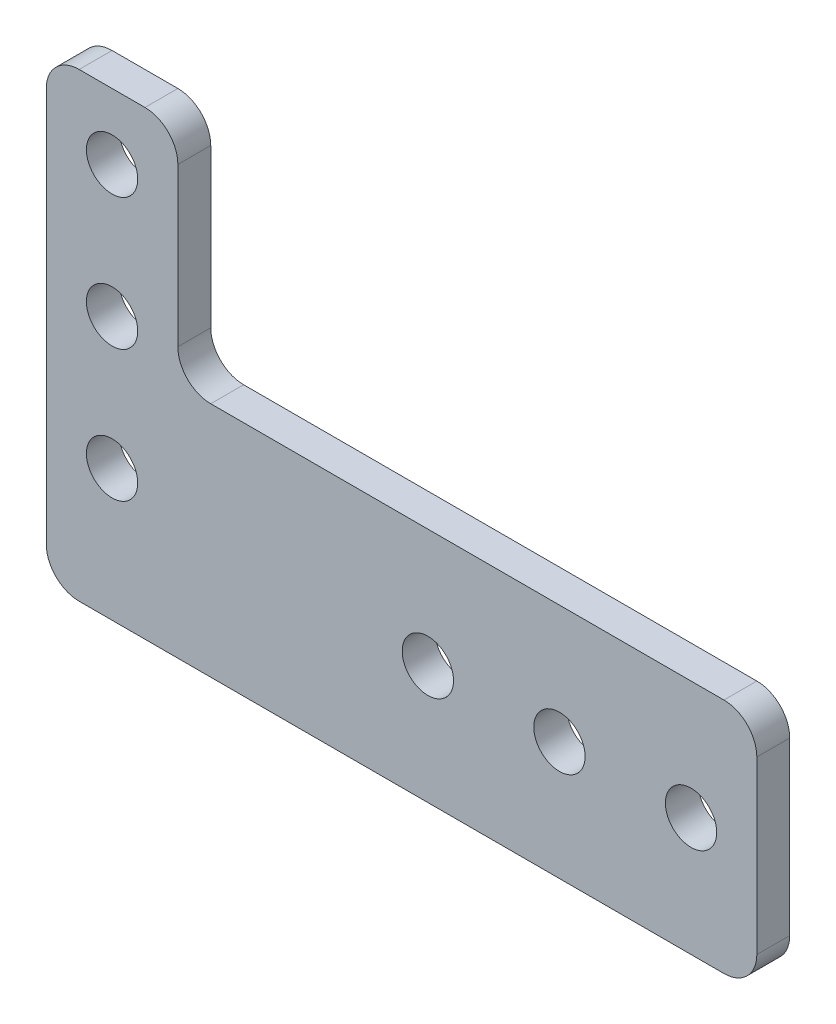
ISO-10303-21;
HEADER;
FILE_DESCRIPTION(('STEP AP214'),'2;1');
FILE_NAME('part.step','',(''),(''),'','','');
FILE_SCHEMA(('AUTOMOTIVE_DESIGN { 1 0 10303 214 1 1 1 1 }'));
ENDSEC;
DATA;
#1=APPLICATION_CONTEXT('core data for automotive mechanical design processes');
#2=APPLICATION_PROTOCOL_DEFINITION('international standard','automotive_design',2000,#1);
#3=PRODUCT_CONTEXT('',#1,'mechanical');
#4=PRODUCT('Part','Part','',(#3));
#5=PRODUCT_RELATED_PRODUCT_CATEGORY('part','',(#4));
#6=PRODUCT_DEFINITION_FORMATION('','',#4);
#7=PRODUCT_DEFINITION_CONTEXT('part definition',#1,'design');
#8=PRODUCT_DEFINITION('design','',#6,#7);
#9=PRODUCT_DEFINITION_SHAPE('','',#8);
#10=(LENGTH_UNIT() NAMED_UNIT(*) SI_UNIT(.MILLI.,.METRE.));
#11=(NAMED_UNIT(*) PLANE_ANGLE_UNIT() SI_UNIT($,.RADIAN.));
#12=(NAMED_UNIT(*) SI_UNIT($,.STERADIAN.) SOLID_ANGLE_UNIT());
#13=UNCERTAINTY_MEASURE_WITH_UNIT(LENGTH_MEASURE(1.E-05),#10,'distance_accuracy_value','');
#14=(GEOMETRIC_REPRESENTATION_CONTEXT(3) GLOBAL_UNCERTAINTY_ASSIGNED_CONTEXT((#13)) GLOBAL_UNIT_ASSIGNED_CONTEXT((#10,
#11,#12)) REPRESENTATION_CONTEXT('',''));
#15=CARTESIAN_POINT('',(0.,0.,0.));
#16=DIRECTION('',(0.,0.,1.));
#17=DIRECTION('',(1.,0.,0.));
#18=AXIS2_PLACEMENT_3D('',#15,#16,#17);
#19=CARTESIAN_POINT('',(0.,0.,3.175));
#20=DIRECTION('',(0.,0.,-1.));
#21=DIRECTION('',(-1.,0.,0.));
#22=AXIS2_PLACEMENT_3D('',#19,#20,#21);
#23=PLANE('',#22);
#24=DIRECTION('',(0.,1.,0.));
#25=VECTOR('',#24,1.);
#26=CARTESIAN_POINT('',(69.85,1.27,3.175));
#27=LINE('',#26,#25);
#28=CARTESIAN_POINT('',(69.85,4.445,3.175));
#29=VERTEX_POINT('',#28);
#30=CARTESIAN_POINT('',(69.85,20.955,3.175));
#31=VERTEX_POINT('',#30);
#32=EDGE_CURVE('E237',#29,#31,#27,.T.);
#33=ORIENTED_EDGE('',*,*,#32,.T.);
#34=CARTESIAN_POINT('',(66.675,20.955,3.175));
#35=DIRECTION('',(0.,0.,-1.));
#36=DIRECTION('',(-1.,0.,0.));
#37=AXIS2_PLACEMENT_3D('',#34,#35,#36);
#38=CIRCLE('',#37,3.175);
#39=CARTESIAN_POINT('',(66.675,24.13,3.175));
#40=VERTEX_POINT('',#39);
#41=EDGE_CURVE('E203',#31,#40,#38,.F.);
#42=ORIENTED_EDGE('',*,*,#41,.T.);
#43=DIRECTION('',(-1.,0.,0.));
#44=VECTOR('',#43,1.);
#45=CARTESIAN_POINT('',(69.85,24.13,3.175));
#46=LINE('',#45,#44);
#47=CARTESIAN_POINT('',(17.145,24.13,3.175));
#48=VERTEX_POINT('',#47);
#49=EDGE_CURVE('E153',#40,#48,#46,.T.);
#50=ORIENTED_EDGE('',*,*,#49,.T.);
#51=CARTESIAN_POINT('',(17.145,27.305,3.175));
#52=DIRECTION('',(0.,0.,-1.));
#53=DIRECTION('',(-1.,0.,0.));
#54=AXIS2_PLACEMENT_3D('',#51,#52,#53);
#55=CIRCLE('',#54,3.175);
#56=CARTESIAN_POINT('',(13.97,27.305,3.175));
#57=VERTEX_POINT('',#56);
#58=EDGE_CURVE('E11',#48,#57,#55,.T.);
#59=ORIENTED_EDGE('',*,*,#58,.T.);
#60=DIRECTION('',(0.,1.,0.));
#61=VECTOR('',#60,1.);
#62=CARTESIAN_POINT('',(13.97,45.72,3.175));
#63=LINE('',#62,#61);
#64=CARTESIAN_POINT('',(13.97,42.545,3.175));
#65=VERTEX_POINT('',#64);
#66=EDGE_CURVE('E174',#57,#65,#63,.T.);
#67=ORIENTED_EDGE('',*,*,#66,.T.);
#68=CARTESIAN_POINT('',(10.795,42.545,3.175));
#69=DIRECTION('',(0.,0.,-1.));
#70=DIRECTION('',(-1.,0.,0.));
#71=AXIS2_PLACEMENT_3D('',#68,#69,#70);
#72=CIRCLE('',#71,3.175);
#73=CARTESIAN_POINT('',(10.795,45.72,3.175));
#74=VERTEX_POINT('',#73);
#75=EDGE_CURVE('E191',#65,#74,#72,.F.);
#76=ORIENTED_EDGE('',*,*,#75,.T.);
#77=DIRECTION('',(-1.,0.,0.));
#78=VECTOR('',#77,1.);
#79=CARTESIAN_POINT('',(1.27,45.72,3.175));
#80=LINE('',#79,#78);
#81=CARTESIAN_POINT('',(4.445,45.72,3.175));
#82=VERTEX_POINT('',#81);
#83=EDGE_CURVE('E167',#74,#82,#80,.T.);
#84=ORIENTED_EDGE('',*,*,#83,.T.);
#85=CARTESIAN_POINT('',(4.445,42.545,3.175));
#86=DIRECTION('',(0.,0.,-1.));
#87=DIRECTION('',(-1.,0.,0.));
#88=AXIS2_PLACEMENT_3D('',#85,#86,#87);
#89=CIRCLE('',#88,3.175);
#90=CARTESIAN_POINT('',(1.27,42.545,3.175));
#91=VERTEX_POINT('',#90);
#92=EDGE_CURVE('E194',#82,#91,#89,.F.);
#93=ORIENTED_EDGE('',*,*,#92,.T.);
#94=DIRECTION('',(0.,-1.,0.));
#95=VECTOR('',#94,1.);
#96=CARTESIAN_POINT('',(1.27,1.27,3.175));
#97=LINE('',#96,#95);
#98=CARTESIAN_POINT('',(1.27,4.445,3.175));
#99=VERTEX_POINT('',#98);
#100=EDGE_CURVE('E245',#91,#99,#97,.T.);
#101=ORIENTED_EDGE('',*,*,#100,.T.);
#102=CARTESIAN_POINT('',(4.445,4.445,3.175));
#103=DIRECTION('',(0.,0.,-1.));
#104=DIRECTION('',(-1.,0.,0.));
#105=AXIS2_PLACEMENT_3D('',#102,#103,#104);
#106=CIRCLE('',#105,3.175);
#107=CARTESIAN_POINT('',(4.445,1.27,3.175));
#108=VERTEX_POINT('',#107);
#109=EDGE_CURVE('E197',#99,#108,#106,.F.);
#110=ORIENTED_EDGE('',*,*,#109,.T.);
#111=DIRECTION('',(1.,0.,0.));
#112=VECTOR('',#111,1.);
#113=CARTESIAN_POINT('',(1.27,1.27,3.175));
#114=LINE('',#113,#112);
#115=CARTESIAN_POINT('',(66.675,1.27,3.175));
#116=VERTEX_POINT('',#115);
#117=EDGE_CURVE('E241',#108,#116,#114,.T.);
#118=ORIENTED_EDGE('',*,*,#117,.T.);
#119=CARTESIAN_POINT('',(66.675,4.445,3.175));
#120=DIRECTION('',(0.,0.,-1.));
#121=DIRECTION('',(-1.,0.,0.));
#122=AXIS2_PLACEMENT_3D('',#119,#120,#121);
#123=CIRCLE('',#122,3.175);
#124=EDGE_CURVE('E200',#116,#29,#123,.F.);
#125=ORIENTED_EDGE('',*,*,#124,.T.);
#126=EDGE_LOOP('',(#33,#42,#50,#59,#67,#76,#84,#93,#101,#110,#118,#125));
#127=FACE_BOUND('',#126,.T.);
#128=CARTESIAN_POINT('',(7.62,39.37,3.175));
#129=DIRECTION('',(0.,0.,1.));
#130=DIRECTION('',(1.,0.,0.));
#131=AXIS2_PLACEMENT_3D('',#128,#129,#130);
#132=CIRCLE('',#131,2.4765);
#133=CARTESIAN_POINT('',(10.0965,39.37,3.175));
#134=VERTEX_POINT('',#133);
#135=EDGE_CURVE('E263',#134,#134,#132,.T.);
#136=ORIENTED_EDGE('',*,*,#135,.F.);
#137=EDGE_LOOP('',(#136));
#138=FACE_BOUND('',#137,.T.);
#139=CARTESIAN_POINT('',(7.62,26.67,3.175));
#140=DIRECTION('',(0.,0.,1.));
#141=DIRECTION('',(1.,0.,0.));
#142=AXIS2_PLACEMENT_3D('',#139,#140,#141);
#143=CIRCLE('',#142,2.4765);
#144=CARTESIAN_POINT('',(10.0965,26.67,3.175));
#145=VERTEX_POINT('',#144);
#146=EDGE_CURVE('E518',#145,#145,#143,.T.);
#147=ORIENTED_EDGE('',*,*,#146,.F.);
#148=EDGE_LOOP('',(#147));
#149=FACE_BOUND('',#148,.T.);
#150=CARTESIAN_POINT('',(7.62,13.97,3.175));
#151=DIRECTION('',(0.,0.,1.));
#152=DIRECTION('',(1.,0.,0.));
#153=AXIS2_PLACEMENT_3D('',#150,#151,#152);
#154=CIRCLE('',#153,2.4765);
#155=CARTESIAN_POINT('',(10.0965,13.97,3.175));
#156=VERTEX_POINT('',#155);
#157=EDGE_CURVE('E523',#156,#156,#154,.T.);
#158=ORIENTED_EDGE('',*,*,#157,.F.);
#159=EDGE_LOOP('',(#158));
#160=FACE_BOUND('',#159,.T.);
#161=CARTESIAN_POINT('',(38.1,12.7,3.175));
#162=DIRECTION('',(0.,0.,1.));
#163=DIRECTION('',(1.,0.,0.));
#164=AXIS2_PLACEMENT_3D('',#161,#162,#163);
#165=CIRCLE('',#164,2.4765);
#166=CARTESIAN_POINT('',(40.5765,12.7,3.175));
#167=VERTEX_POINT('',#166);
#168=EDGE_CURVE('E547',#167,#167,#165,.T.);
#169=ORIENTED_EDGE('',*,*,#168,.F.);
#170=EDGE_LOOP('',(#169));
#171=FACE_BOUND('',#170,.T.);
#172=CARTESIAN_POINT('',(50.8,12.7,3.175));
#173=DIRECTION('',(0.,0.,1.));
#174=DIRECTION('',(1.,0.,0.));
#175=AXIS2_PLACEMENT_3D('',#172,#173,#174);
#176=CIRCLE('',#175,2.4765);
#177=CARTESIAN_POINT('',(53.2765,12.7,3.175));
#178=VERTEX_POINT('',#177);
#179=EDGE_CURVE('E551',#178,#178,#176,.T.);
#180=ORIENTED_EDGE('',*,*,#179,.F.);
#181=EDGE_LOOP('',(#180));
#182=FACE_BOUND('',#181,.T.);
#183=CARTESIAN_POINT('',(63.5,12.7,3.175));
#184=DIRECTION('',(0.,0.,1.));
#185=DIRECTION('',(1.,0.,0.));
#186=AXIS2_PLACEMENT_3D('',#183,#184,#185);
#187=CIRCLE('',#186,2.4765);
#188=CARTESIAN_POINT('',(65.9765,12.7,3.175));
#189=VERTEX_POINT('',#188);
#190=EDGE_CURVE('E554',#189,#189,#187,.T.);
#191=ORIENTED_EDGE('',*,*,#190,.F.);
#192=EDGE_LOOP('',(#191));
#193=FACE_BOUND('',#192,.T.);
#194=ADVANCED_FACE('F43',(#127,#138,#149,#160,#171,#182,#193),#23,.F.);
#195=CARTESIAN_POINT('',(0.,0.,0.));
#196=DIRECTION('',(0.,0.,-1.));
#197=DIRECTION('',(-1.,0.,0.));
#198=AXIS2_PLACEMENT_3D('',#195,#196,#197);
#199=PLANE('',#198);
#200=CARTESIAN_POINT('',(50.8,12.7,0.));
#201=DIRECTION('',(0.,0.,1.));
#202=DIRECTION('',(1.,0.,0.));
#203=AXIS2_PLACEMENT_3D('',#200,#201,#202);
#204=CIRCLE('',#203,2.4765);
#205=CARTESIAN_POINT('',(53.2765,12.7,0.));
#206=VERTEX_POINT('',#205);
#207=EDGE_CURVE('E556',#206,#206,#204,.T.);
#208=ORIENTED_EDGE('',*,*,#207,.T.);
#209=EDGE_LOOP('',(#208));
#210=FACE_BOUND('',#209,.T.);
#211=CARTESIAN_POINT('',(7.62,13.97,0.));
#212=DIRECTION('',(0.,0.,1.));
#213=DIRECTION('',(1.,0.,0.));
#214=AXIS2_PLACEMENT_3D('',#211,#212,#213);
#215=CIRCLE('',#214,2.4765);
#216=CARTESIAN_POINT('',(10.0965,13.97,0.));
#217=VERTEX_POINT('',#216);
#218=EDGE_CURVE('E529',#217,#217,#215,.T.);
#219=ORIENTED_EDGE('',*,*,#218,.T.);
#220=EDGE_LOOP('',(#219));
#221=FACE_BOUND('',#220,.T.);
#222=CARTESIAN_POINT('',(7.62,39.37,0.));
#223=DIRECTION('',(0.,0.,1.));
#224=DIRECTION('',(1.,0.,0.));
#225=AXIS2_PLACEMENT_3D('',#222,#223,#224);
#226=CIRCLE('',#225,2.4765);
#227=CARTESIAN_POINT('',(10.0965,39.37,0.));
#228=VERTEX_POINT('',#227);
#229=EDGE_CURVE('E255',#228,#228,#226,.T.);
#230=ORIENTED_EDGE('',*,*,#229,.T.);
#231=EDGE_LOOP('',(#230));
#232=FACE_BOUND('',#231,.T.);
#233=DIRECTION('',(-1.,0.,0.));
#234=VECTOR('',#233,1.);
#235=CARTESIAN_POINT('',(69.85,24.13,0.));
#236=LINE('',#235,#234);
#237=CARTESIAN_POINT('',(66.675,24.13,0.));
#238=VERTEX_POINT('',#237);
#239=CARTESIAN_POINT('',(17.145,24.13,0.));
#240=VERTEX_POINT('',#239);
#241=EDGE_CURVE('E151',#238,#240,#236,.T.);
#242=ORIENTED_EDGE('',*,*,#241,.F.);
#243=CARTESIAN_POINT('',(66.675,20.955,0.));
#244=DIRECTION('',(0.,0.,-1.));
#245=DIRECTION('',(-1.,0.,0.));
#246=AXIS2_PLACEMENT_3D('',#243,#244,#245);
#247=CIRCLE('',#246,3.175);
#248=CARTESIAN_POINT('',(69.85,20.955,0.));
#249=VERTEX_POINT('',#248);
#250=EDGE_CURVE('E133',#238,#249,#247,.T.);
#251=ORIENTED_EDGE('',*,*,#250,.T.);
#252=DIRECTION('',(0.,1.,0.));
#253=VECTOR('',#252,1.);
#254=CARTESIAN_POINT('',(69.85,1.27,0.));
#255=LINE('',#254,#253);
#256=CARTESIAN_POINT('',(69.85,4.445,0.));
#257=VERTEX_POINT('',#256);
#258=EDGE_CURVE('E163',#257,#249,#255,.T.);
#259=ORIENTED_EDGE('',*,*,#258,.F.);
#260=CARTESIAN_POINT('',(66.675,4.445,0.));
#261=DIRECTION('',(0.,0.,-1.));
#262=DIRECTION('',(-1.,0.,0.));
#263=AXIS2_PLACEMENT_3D('',#260,#261,#262);
#264=CIRCLE('',#263,3.175);
#265=CARTESIAN_POINT('',(66.675,1.27,0.));
#266=VERTEX_POINT('',#265);
#267=EDGE_CURVE('E145',#257,#266,#264,.T.);
#268=ORIENTED_EDGE('',*,*,#267,.T.);
#269=DIRECTION('',(1.,0.,0.));
#270=VECTOR('',#269,1.);
#271=CARTESIAN_POINT('',(1.27,1.27,0.));
#272=LINE('',#271,#270);
#273=CARTESIAN_POINT('',(4.445,1.27,0.));
#274=VERTEX_POINT('',#273);
#275=EDGE_CURVE('E169',#274,#266,#272,.T.);
#276=ORIENTED_EDGE('',*,*,#275,.F.);
#277=CARTESIAN_POINT('',(4.445,4.445,0.));
#278=DIRECTION('',(0.,0.,-1.));
#279=DIRECTION('',(-1.,0.,0.));
#280=AXIS2_PLACEMENT_3D('',#277,#278,#279);
#281=CIRCLE('',#280,3.175);
#282=CARTESIAN_POINT('',(1.27,4.445,0.));
#283=VERTEX_POINT('',#282);
#284=EDGE_CURVE('E181',#274,#283,#281,.T.);
#285=ORIENTED_EDGE('',*,*,#284,.T.);
#286=DIRECTION('',(0.,-1.,0.));
#287=VECTOR('',#286,1.);
#288=CARTESIAN_POINT('',(1.27,1.27,0.));
#289=LINE('',#288,#287);
#290=CARTESIAN_POINT('',(1.27,42.545,0.));
#291=VERTEX_POINT('',#290);
#292=EDGE_CURVE('E262',#291,#283,#289,.T.);
#293=ORIENTED_EDGE('',*,*,#292,.F.);
#294=CARTESIAN_POINT('',(4.445,42.545,0.));
#295=DIRECTION('',(0.,0.,-1.));
#296=DIRECTION('',(-1.,0.,0.));
#297=AXIS2_PLACEMENT_3D('',#294,#295,#296);
#298=CIRCLE('',#297,3.175);
#299=CARTESIAN_POINT('',(4.445,45.72,0.));
#300=VERTEX_POINT('',#299);
#301=EDGE_CURVE('E178',#291,#300,#298,.T.);
#302=ORIENTED_EDGE('',*,*,#301,.T.);
#303=DIRECTION('',(-1.,0.,0.));
#304=VECTOR('',#303,1.);
#305=CARTESIAN_POINT('',(1.27,45.72,0.));
#306=LINE('',#305,#304);
#307=CARTESIAN_POINT('',(10.795,45.72,0.));
#308=VERTEX_POINT('',#307);
#309=EDGE_CURVE('E258',#308,#300,#306,.T.);
#310=ORIENTED_EDGE('',*,*,#309,.F.);
#311=CARTESIAN_POINT('',(10.795,42.545,0.));
#312=DIRECTION('',(0.,0.,-1.));
#313=DIRECTION('',(-1.,0.,0.));
#314=AXIS2_PLACEMENT_3D('',#311,#312,#313);
#315=CIRCLE('',#314,3.175);
#316=CARTESIAN_POINT('',(13.97,42.545,0.));
#317=VERTEX_POINT('',#316);
#318=EDGE_CURVE('E155',#308,#317,#315,.T.);
#319=ORIENTED_EDGE('',*,*,#318,.T.);
#320=DIRECTION('',(0.,1.,0.));
#321=VECTOR('',#320,1.);
#322=CARTESIAN_POINT('',(13.97,45.72,0.));
#323=LINE('',#322,#321);
#324=CARTESIAN_POINT('',(13.97,27.305,0.));
#325=VERTEX_POINT('',#324);
#326=EDGE_CURVE('E162',#325,#317,#323,.T.);
#327=ORIENTED_EDGE('',*,*,#326,.F.);
#328=CARTESIAN_POINT('',(17.145,27.305,0.));
#329=DIRECTION('',(0.,0.,-1.));
#330=DIRECTION('',(-1.,0.,0.));
#331=AXIS2_PLACEMENT_3D('',#328,#329,#330);
#332=CIRCLE('',#331,3.175);
#333=EDGE_CURVE('E52',#325,#240,#332,.F.);
#334=ORIENTED_EDGE('',*,*,#333,.T.);
#335=EDGE_LOOP('',(#242,#251,#259,#268,#276,#285,#293,#302,#310,#319,#327,#334));
#336=FACE_BOUND('',#335,.T.);
#337=CARTESIAN_POINT('',(7.62,26.67,0.));
#338=DIRECTION('',(0.,0.,1.));
#339=DIRECTION('',(1.,0.,0.));
#340=AXIS2_PLACEMENT_3D('',#337,#338,#339);
#341=CIRCLE('',#340,2.4765);
#342=CARTESIAN_POINT('',(10.0965,26.67,0.));
#343=VERTEX_POINT('',#342);
#344=EDGE_CURVE('E521',#343,#343,#341,.T.);
#345=ORIENTED_EDGE('',*,*,#344,.T.);
#346=EDGE_LOOP('',(#345));
#347=FACE_BOUND('',#346,.T.);
#348=CARTESIAN_POINT('',(38.1,12.7,0.));
#349=DIRECTION('',(0.,0.,1.));
#350=DIRECTION('',(1.,0.,0.));
#351=AXIS2_PLACEMENT_3D('',#348,#349,#350);
#352=CIRCLE('',#351,2.4765);
#353=CARTESIAN_POINT('',(40.5765,12.7,0.));
#354=VERTEX_POINT('',#353);
#355=EDGE_CURVE('E567',#354,#354,#352,.T.);
#356=ORIENTED_EDGE('',*,*,#355,.T.);
#357=EDGE_LOOP('',(#356));
#358=FACE_BOUND('',#357,.T.);
#359=CARTESIAN_POINT('',(63.5,12.7,0.));
#360=DIRECTION('',(0.,0.,1.));
#361=DIRECTION('',(1.,0.,0.));
#362=AXIS2_PLACEMENT_3D('',#359,#360,#361);
#363=CIRCLE('',#362,2.4765);
#364=CARTESIAN_POINT('',(65.9765,12.7,0.));
#365=VERTEX_POINT('',#364);
#366=EDGE_CURVE('E557',#365,#365,#363,.T.);
#367=ORIENTED_EDGE('',*,*,#366,.T.);
#368=EDGE_LOOP('',(#367));
#369=FACE_BOUND('',#368,.T.);
#370=ADVANCED_FACE('F158',(#210,#221,#232,#336,#347,#358,#369),#199,.T.);
#371=CARTESIAN_POINT('',(1.27,45.72,3.175));
#372=DIRECTION('',(0.,-1.,0.));
#373=DIRECTION('',(0.,0.,-1.));
#374=AXIS2_PLACEMENT_3D('',#371,#372,#373);
#375=PLANE('',#374);
#376=ORIENTED_EDGE('',*,*,#309,.T.);
#377=DIRECTION('',(0.,0.,-1.));
#378=VECTOR('',#377,1.);
#379=CARTESIAN_POINT('',(4.445,45.72,3.175));
#380=LINE('',#379,#378);
#381=EDGE_CURVE('E224',#300,#82,#380,.F.);
#382=ORIENTED_EDGE('',*,*,#381,.T.);
#383=ORIENTED_EDGE('',*,*,#83,.F.);
#384=DIRECTION('',(0.,0.,-1.));
#385=VECTOR('',#384,1.);
#386=CARTESIAN_POINT('',(10.795,45.72,3.175));
#387=LINE('',#386,#385);
#388=EDGE_CURVE('E220',#74,#308,#387,.T.);
#389=ORIENTED_EDGE('',*,*,#388,.T.);
#390=EDGE_LOOP('',(#376,#382,#383,#389));
#391=FACE_BOUND('',#390,.T.);
#392=ADVANCED_FACE('F297',(#391),#375,.F.);
#393=CARTESIAN_POINT('',(1.27,1.27,3.175));
#394=DIRECTION('',(1.,0.,0.));
#395=DIRECTION('',(0.,1.,0.));
#396=AXIS2_PLACEMENT_3D('',#393,#394,#395);
#397=PLANE('',#396);
#398=ORIENTED_EDGE('',*,*,#292,.T.);
#399=DIRECTION('',(0.,0.,-1.));
#400=VECTOR('',#399,1.);
#401=CARTESIAN_POINT('',(1.27,4.445,3.175));
#402=LINE('',#401,#400);
#403=EDGE_CURVE('E217',#283,#99,#402,.F.);
#404=ORIENTED_EDGE('',*,*,#403,.T.);
#405=ORIENTED_EDGE('',*,*,#100,.F.);
#406=DIRECTION('',(0.,0.,-1.));
#407=VECTOR('',#406,1.);
#408=CARTESIAN_POINT('',(1.27,42.545,3.175));
#409=LINE('',#408,#407);
#410=EDGE_CURVE('E213',#91,#291,#409,.T.);
#411=ORIENTED_EDGE('',*,*,#410,.T.);
#412=EDGE_LOOP('',(#398,#404,#405,#411));
#413=FACE_BOUND('',#412,.T.);
#414=ADVANCED_FACE('F290',(#413),#397,.F.);
#415=CARTESIAN_POINT('',(1.27,1.27,3.175));
#416=DIRECTION('',(0.,1.,0.));
#417=DIRECTION('',(0.,0.,1.));
#418=AXIS2_PLACEMENT_3D('',#415,#416,#417);
#419=PLANE('',#418);
#420=ORIENTED_EDGE('',*,*,#275,.T.);
#421=DIRECTION('',(0.,0.,-1.));
#422=VECTOR('',#421,1.);
#423=CARTESIAN_POINT('',(66.675,1.27,3.175));
#424=LINE('',#423,#422);
#425=EDGE_CURVE('E210',#266,#116,#424,.F.);
#426=ORIENTED_EDGE('',*,*,#425,.T.);
#427=ORIENTED_EDGE('',*,*,#117,.F.);
#428=DIRECTION('',(0.,0.,-1.));
#429=VECTOR('',#428,1.);
#430=CARTESIAN_POINT('',(4.445,1.27,3.175));
#431=LINE('',#430,#429);
#432=EDGE_CURVE('E206',#108,#274,#431,.T.);
#433=ORIENTED_EDGE('',*,*,#432,.T.);
#434=EDGE_LOOP('',(#420,#426,#427,#433));
#435=FACE_BOUND('',#434,.T.);
#436=ADVANCED_FACE('F271',(#435),#419,.F.);
#437=CARTESIAN_POINT('',(69.85,1.27,3.175));
#438=DIRECTION('',(-1.,0.,0.));
#439=DIRECTION('',(0.,0.,1.));
#440=AXIS2_PLACEMENT_3D('',#437,#438,#439);
#441=PLANE('',#440);
#442=ORIENTED_EDGE('',*,*,#258,.T.);
#443=DIRECTION('',(0.,0.,-1.));
#444=VECTOR('',#443,1.);
#445=CARTESIAN_POINT('',(69.85,20.955,3.175));
#446=LINE('',#445,#444);
#447=EDGE_CURVE('E138',#249,#31,#446,.F.);
#448=ORIENTED_EDGE('',*,*,#447,.T.);
#449=ORIENTED_EDGE('',*,*,#32,.F.);
#450=DIRECTION('',(0.,0.,-1.));
#451=VECTOR('',#450,1.);
#452=CARTESIAN_POINT('',(69.85,4.445,3.175));
#453=LINE('',#452,#451);
#454=EDGE_CURVE('E144',#29,#257,#453,.T.);
#455=ORIENTED_EDGE('',*,*,#454,.T.);
#456=EDGE_LOOP('',(#442,#448,#449,#455));
#457=FACE_BOUND('',#456,.T.);
#458=ADVANCED_FACE('F281',(#457),#441,.F.);
#459=CARTESIAN_POINT('',(69.85,24.13,3.175));
#460=DIRECTION('',(0.,-1.,0.));
#461=DIRECTION('',(1.,0.,0.));
#462=AXIS2_PLACEMENT_3D('',#459,#460,#461);
#463=PLANE('',#462);
#464=ORIENTED_EDGE('',*,*,#49,.F.);
#465=DIRECTION('',(0.,0.,-1.));
#466=VECTOR('',#465,1.);
#467=CARTESIAN_POINT('',(66.675,24.13,3.175));
#468=LINE('',#467,#466);
#469=EDGE_CURVE('E137',#40,#238,#468,.T.);
#470=ORIENTED_EDGE('',*,*,#469,.T.);
#471=ORIENTED_EDGE('',*,*,#241,.T.);
#472=DIRECTION('',(0.,0.,-1.));
#473=VECTOR('',#472,1.);
#474=CARTESIAN_POINT('',(17.145,24.13,3.175));
#475=LINE('',#474,#473);
#476=EDGE_CURVE('E156',#240,#48,#475,.F.);
#477=ORIENTED_EDGE('',*,*,#476,.T.);
#478=EDGE_LOOP('',(#464,#470,#471,#477));
#479=FACE_BOUND('',#478,.T.);
#480=ADVANCED_FACE('F150',(#479),#463,.F.);
#481=CARTESIAN_POINT('',(13.97,45.72,3.175));
#482=DIRECTION('',(-1.,0.,0.));
#483=DIRECTION('',(0.,-1.,0.));
#484=AXIS2_PLACEMENT_3D('',#481,#482,#483);
#485=PLANE('',#484);
#486=ORIENTED_EDGE('',*,*,#66,.F.);
#487=DIRECTION('',(0.,0.,-1.));
#488=VECTOR('',#487,1.);
#489=CARTESIAN_POINT('',(13.97,27.305,0.));
#490=LINE('',#489,#488);
#491=EDGE_CURVE('E229',#57,#325,#490,.T.);
#492=ORIENTED_EDGE('',*,*,#491,.T.);
#493=ORIENTED_EDGE('',*,*,#326,.T.);
#494=DIRECTION('',(0.,0.,-1.));
#495=VECTOR('',#494,1.);
#496=CARTESIAN_POINT('',(13.97,42.545,3.175));
#497=LINE('',#496,#495);
#498=EDGE_CURVE('E59',#317,#65,#497,.F.);
#499=ORIENTED_EDGE('',*,*,#498,.T.);
#500=EDGE_LOOP('',(#486,#492,#493,#499));
#501=FACE_BOUND('',#500,.T.);
#502=ADVANCED_FACE('F288',(#501),#485,.F.);
#503=CARTESIAN_POINT('',(7.62,39.37,3.175));
#504=DIRECTION('',(0.,0.,-1.));
#505=DIRECTION('',(-1.,0.,0.));
#506=AXIS2_PLACEMENT_3D('',#503,#504,#505);
#507=CYLINDRICAL_SURFACE('',#506,2.4765);
#508=ORIENTED_EDGE('',*,*,#135,.T.);
#509=EDGE_LOOP('',(#508));
#510=FACE_BOUND('',#509,.T.);
#511=ORIENTED_EDGE('',*,*,#229,.F.);
#512=EDGE_LOOP('',(#511));
#513=FACE_BOUND('',#512,.T.);
#514=ADVANCED_FACE('F301',(#510,#513),#507,.F.);
#515=CARTESIAN_POINT('',(7.62,26.67,3.175));
#516=DIRECTION('',(0.,0.,-1.));
#517=DIRECTION('',(-1.,0.,0.));
#518=AXIS2_PLACEMENT_3D('',#515,#516,#517);
#519=CYLINDRICAL_SURFACE('',#518,2.4765);
#520=ORIENTED_EDGE('',*,*,#146,.T.);
#521=EDGE_LOOP('',(#520));
#522=FACE_BOUND('',#521,.T.);
#523=ORIENTED_EDGE('',*,*,#344,.F.);
#524=EDGE_LOOP('',(#523));
#525=FACE_BOUND('',#524,.T.);
#526=ADVANCED_FACE('F308',(#522,#525),#519,.F.);
#527=CARTESIAN_POINT('',(7.62,13.97,3.175));
#528=DIRECTION('',(0.,0.,-1.));
#529=DIRECTION('',(-1.,0.,0.));
#530=AXIS2_PLACEMENT_3D('',#527,#528,#529);
#531=CYLINDRICAL_SURFACE('',#530,2.4765);
#532=ORIENTED_EDGE('',*,*,#157,.T.);
#533=EDGE_LOOP('',(#532));
#534=FACE_BOUND('',#533,.T.);
#535=ORIENTED_EDGE('',*,*,#218,.F.);
#536=EDGE_LOOP('',(#535));
#537=FACE_BOUND('',#536,.T.);
#538=ADVANCED_FACE('F448',(#534,#537),#531,.F.);
#539=CARTESIAN_POINT('',(38.1,12.7,3.175));
#540=DIRECTION('',(0.,0.,-1.));
#541=DIRECTION('',(-1.,0.,0.));
#542=AXIS2_PLACEMENT_3D('',#539,#540,#541);
#543=CYLINDRICAL_SURFACE('',#542,2.4765);
#544=ORIENTED_EDGE('',*,*,#168,.T.);
#545=EDGE_LOOP('',(#544));
#546=FACE_BOUND('',#545,.T.);
#547=ORIENTED_EDGE('',*,*,#355,.F.);
#548=EDGE_LOOP('',(#547));
#549=FACE_BOUND('',#548,.T.);
#550=ADVANCED_FACE('F438',(#546,#549),#543,.F.);
#551=CARTESIAN_POINT('',(50.8,12.7,3.175));
#552=DIRECTION('',(0.,0.,-1.));
#553=DIRECTION('',(-1.,0.,0.));
#554=AXIS2_PLACEMENT_3D('',#551,#552,#553);
#555=CYLINDRICAL_SURFACE('',#554,2.4765);
#556=ORIENTED_EDGE('',*,*,#179,.T.);
#557=EDGE_LOOP('',(#556));
#558=FACE_BOUND('',#557,.T.);
#559=ORIENTED_EDGE('',*,*,#207,.F.);
#560=EDGE_LOOP('',(#559));
#561=FACE_BOUND('',#560,.T.);
#562=ADVANCED_FACE('F428',(#558,#561),#555,.F.);
#563=CARTESIAN_POINT('',(63.5,12.7,3.175));
#564=DIRECTION('',(0.,0.,-1.));
#565=DIRECTION('',(-1.,0.,0.));
#566=AXIS2_PLACEMENT_3D('',#563,#564,#565);
#567=CYLINDRICAL_SURFACE('',#566,2.4765);
#568=ORIENTED_EDGE('',*,*,#190,.T.);
#569=EDGE_LOOP('',(#568));
#570=FACE_BOUND('',#569,.T.);
#571=ORIENTED_EDGE('',*,*,#366,.F.);
#572=EDGE_LOOP('',(#571));
#573=FACE_BOUND('',#572,.T.);
#574=ADVANCED_FACE('F332',(#570,#573),#567,.F.);
#575=CARTESIAN_POINT('',(66.675,20.955,3.175));
#576=DIRECTION('',(0.,0.,-1.));
#577=DIRECTION('',(-1.,0.,0.));
#578=AXIS2_PLACEMENT_3D('',#575,#576,#577);
#579=CYLINDRICAL_SURFACE('',#578,3.175);
#580=ORIENTED_EDGE('',*,*,#41,.F.);
#581=ORIENTED_EDGE('',*,*,#447,.F.);
#582=ORIENTED_EDGE('',*,*,#250,.F.);
#583=ORIENTED_EDGE('',*,*,#469,.F.);
#584=EDGE_LOOP('',(#580,#581,#582,#583));
#585=FACE_BOUND('',#584,.T.);
#586=ADVANCED_FACE('F136',(#585),#579,.T.);
#587=CARTESIAN_POINT('',(66.675,4.445,3.175));
#588=DIRECTION('',(0.,0.,-1.));
#589=DIRECTION('',(-1.,0.,0.));
#590=AXIS2_PLACEMENT_3D('',#587,#588,#589);
#591=CYLINDRICAL_SURFACE('',#590,3.175);
#592=ORIENTED_EDGE('',*,*,#124,.F.);
#593=ORIENTED_EDGE('',*,*,#425,.F.);
#594=ORIENTED_EDGE('',*,*,#267,.F.);
#595=ORIENTED_EDGE('',*,*,#454,.F.);
#596=EDGE_LOOP('',(#592,#593,#594,#595));
#597=FACE_BOUND('',#596,.T.);
#598=ADVANCED_FACE('F276',(#597),#591,.T.);
#599=CARTESIAN_POINT('',(4.445,4.445,3.175));
#600=DIRECTION('',(0.,0.,-1.));
#601=DIRECTION('',(-1.,0.,0.));
#602=AXIS2_PLACEMENT_3D('',#599,#600,#601);
#603=CYLINDRICAL_SURFACE('',#602,3.175);
#604=ORIENTED_EDGE('',*,*,#109,.F.);
#605=ORIENTED_EDGE('',*,*,#403,.F.);
#606=ORIENTED_EDGE('',*,*,#284,.F.);
#607=ORIENTED_EDGE('',*,*,#432,.F.);
#608=EDGE_LOOP('',(#604,#605,#606,#607));
#609=FACE_BOUND('',#608,.T.);
#610=ADVANCED_FACE('F321',(#609),#603,.T.);
#611=CARTESIAN_POINT('',(4.445,42.545,3.175));
#612=DIRECTION('',(0.,0.,-1.));
#613=DIRECTION('',(-1.,0.,0.));
#614=AXIS2_PLACEMENT_3D('',#611,#612,#613);
#615=CYLINDRICAL_SURFACE('',#614,3.175);
#616=ORIENTED_EDGE('',*,*,#92,.F.);
#617=ORIENTED_EDGE('',*,*,#381,.F.);
#618=ORIENTED_EDGE('',*,*,#301,.F.);
#619=ORIENTED_EDGE('',*,*,#410,.F.);
#620=EDGE_LOOP('',(#616,#617,#618,#619));
#621=FACE_BOUND('',#620,.T.);
#622=ADVANCED_FACE('F315',(#621),#615,.T.);
#623=CARTESIAN_POINT('',(17.145,27.305,3.175));
#624=DIRECTION('',(0.,0.,1.));
#625=DIRECTION('',(1.,0.,0.));
#626=AXIS2_PLACEMENT_3D('',#623,#624,#625);
#627=CYLINDRICAL_SURFACE('',#626,3.175);
#628=ORIENTED_EDGE('',*,*,#58,.F.);
#629=ORIENTED_EDGE('',*,*,#476,.F.);
#630=ORIENTED_EDGE('',*,*,#333,.F.);
#631=ORIENTED_EDGE('',*,*,#491,.F.);
#632=EDGE_LOOP('',(#628,#629,#630,#631));
#633=FACE_BOUND('',#632,.T.);
#634=ADVANCED_FACE('F313',(#633),#627,.F.);
#635=CARTESIAN_POINT('',(10.795,42.545,3.175));
#636=DIRECTION('',(0.,0.,-1.));
#637=DIRECTION('',(-1.,0.,0.));
#638=AXIS2_PLACEMENT_3D('',#635,#636,#637);
#639=CYLINDRICAL_SURFACE('',#638,3.175);
#640=ORIENTED_EDGE('',*,*,#75,.F.);
#641=ORIENTED_EDGE('',*,*,#498,.F.);
#642=ORIENTED_EDGE('',*,*,#318,.F.);
#643=ORIENTED_EDGE('',*,*,#388,.F.);
#644=EDGE_LOOP('',(#640,#641,#642,#643));
#645=FACE_BOUND('',#644,.T.);
#646=ADVANCED_FACE('F45',(#645),#639,.T.);
#647=CLOSED_SHELL('',(#194,#370,#392,#414,#436,#458,#480,#502,#514,#526,#538,#550,#562,#574,
#586,#598,#610,#622,#634,#646));
#648=MANIFOLD_SOLID_BREP('B2',#647);
#649=ADVANCED_BREP_SHAPE_REPRESENTATION('',(#18,#648),#14);
#650=SHAPE_DEFINITION_REPRESENTATION(#9,#649);
ENDSEC;
END-ISO-10303-21;
